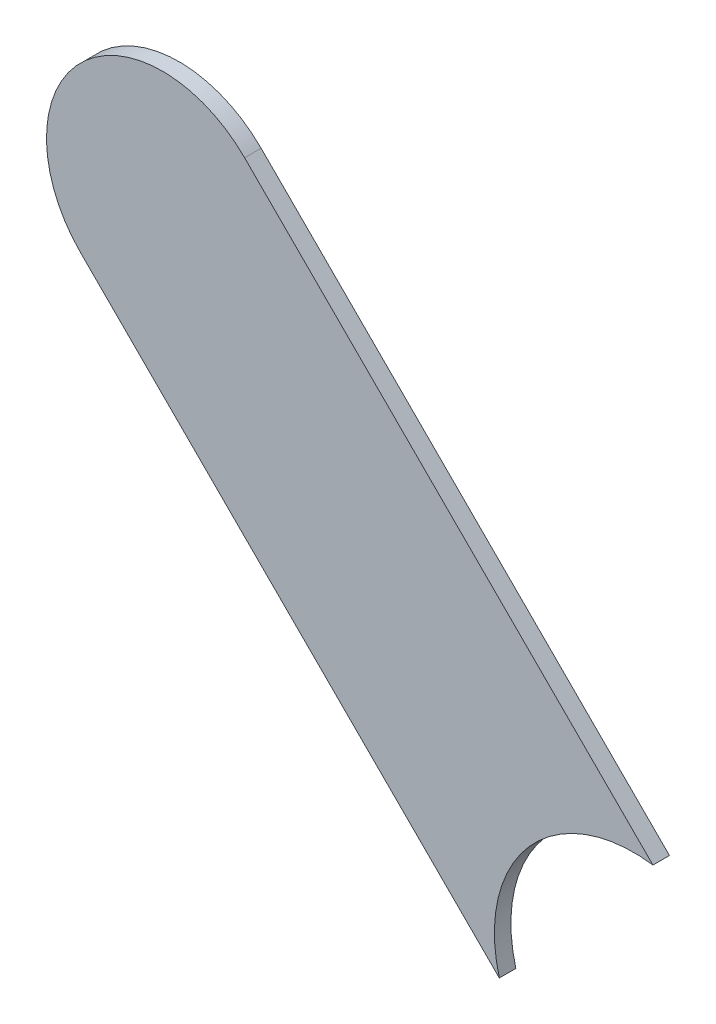
ISO-10303-21;
HEADER;
FILE_DESCRIPTION(('STEP AP214'),'2;1');
FILE_NAME('part.step','',(''),(''),'','','');
FILE_SCHEMA(('AUTOMOTIVE_DESIGN { 1 0 10303 214 1 1 1 1 }'));
ENDSEC;
DATA;
#1=APPLICATION_CONTEXT('core data for automotive mechanical design processes');
#2=APPLICATION_PROTOCOL_DEFINITION('international standard','automotive_design',2000,#1);
#3=PRODUCT_CONTEXT('',#1,'mechanical');
#4=PRODUCT('Part','Part','',(#3));
#5=PRODUCT_RELATED_PRODUCT_CATEGORY('part','',(#4));
#6=PRODUCT_DEFINITION_FORMATION('','',#4);
#7=PRODUCT_DEFINITION_CONTEXT('part definition',#1,'design');
#8=PRODUCT_DEFINITION('design','',#6,#7);
#9=PRODUCT_DEFINITION_SHAPE('','',#8);
#10=(LENGTH_UNIT() NAMED_UNIT(*) SI_UNIT(.MILLI.,.METRE.));
#11=(NAMED_UNIT(*) PLANE_ANGLE_UNIT() SI_UNIT($,.RADIAN.));
#12=(NAMED_UNIT(*) SI_UNIT($,.STERADIAN.) SOLID_ANGLE_UNIT());
#13=UNCERTAINTY_MEASURE_WITH_UNIT(LENGTH_MEASURE(1.E-05),#10,'distance_accuracy_value','');
#14=(GEOMETRIC_REPRESENTATION_CONTEXT(3) GLOBAL_UNCERTAINTY_ASSIGNED_CONTEXT((#13)) GLOBAL_UNIT_ASSIGNED_CONTEXT((#10,
#11,#12)) REPRESENTATION_CONTEXT('',''));
#15=CARTESIAN_POINT('',(0.,0.,0.));
#16=DIRECTION('',(0.,0.,1.));
#17=DIRECTION('',(1.,0.,0.));
#18=AXIS2_PLACEMENT_3D('',#15,#16,#17);
#19=CARTESIAN_POINT('',(96.20834708,104.3232229,0.));
#20=DIRECTION('',(0.707106781186542,0.707106781186553,0.));
#21=DIRECTION('',(0.707106781186553,-0.707106781186542,0.));
#22=AXIS2_PLACEMENT_3D('',#19,#20,#21);
#23=PLANE('',#22);
#24=DIRECTION('',(0.707106781186553,-0.707106781186542,0.));
#25=VECTOR('',#24,1.);
#26=CARTESIAN_POINT('',(96.20834708,104.3232229,0.03556));
#27=LINE('',#26,#25);
#28=CARTESIAN_POINT('',(96.20834708,104.3232229,0.03556));
#29=VERTEX_POINT('',#28);
#30=CARTESIAN_POINT('',(97.1106150682488,103.420954911751,0.03556));
#31=VERTEX_POINT('',#30);
#32=EDGE_CURVE('E11',#29,#31,#27,.T.);
#33=ORIENTED_EDGE('',*,*,#32,.F.);
#34=DIRECTION('',(0.,0.,1.));
#35=VECTOR('',#34,1.);
#36=CARTESIAN_POINT('',(96.20834708,104.3232229,0.));
#37=LINE('',#36,#35);
#38=CARTESIAN_POINT('',(96.20834708,104.3232229,0.));
#39=VERTEX_POINT('',#38);
#40=EDGE_CURVE('E24',#39,#29,#37,.T.);
#41=ORIENTED_EDGE('',*,*,#40,.F.);
#42=DIRECTION('',(0.707106781186553,-0.707106781186542,0.));
#43=VECTOR('',#42,1.);
#44=CARTESIAN_POINT('',(96.20834708,104.3232229,0.));
#45=LINE('',#44,#43);
#46=CARTESIAN_POINT('',(97.1106150682488,103.420954911751,0.));
#47=VERTEX_POINT('',#46);
#48=EDGE_CURVE('E75',#39,#47,#45,.T.);
#49=ORIENTED_EDGE('',*,*,#48,.T.);
#50=DIRECTION('',(0.,0.,1.));
#51=VECTOR('',#50,1.);
#52=CARTESIAN_POINT('',(97.1106150682488,103.420954911751,0.));
#53=LINE('',#52,#51);
#54=EDGE_CURVE('E37',#47,#31,#53,.T.);
#55=ORIENTED_EDGE('',*,*,#54,.T.);
#56=EDGE_LOOP('',(#33,#41,#49,#55));
#57=FACE_BOUND('',#56,.T.);
#58=ADVANCED_FACE('F17',(#57),#23,.F.);
#59=CARTESIAN_POINT('',(97.4000084,103.50001906,0.));
#60=DIRECTION('',(0.,0.,-1.));
#61=DIRECTION('',(1.,0.,0.));
#62=AXIS2_PLACEMENT_3D('',#59,#60,#61);
#63=CYLINDRICAL_SURFACE('',#62,0.2999994);
#64=DIRECTION('',(0.,0.,1.));
#65=VECTOR('',#64,1.);
#66=CARTESIAN_POINT('',(97.4415466764633,103.797128823537,0.));
#67=LINE('',#66,#65);
#68=CARTESIAN_POINT('',(97.4415466764633,103.797128823537,0.));
#69=VERTEX_POINT('',#68);
#70=CARTESIAN_POINT('',(97.4415466764633,103.797128823537,0.03556));
#71=VERTEX_POINT('',#70);
#72=EDGE_CURVE('E67',#69,#71,#67,.T.);
#73=ORIENTED_EDGE('',*,*,#72,.T.);
#74=CARTESIAN_POINT('',(97.4000084,103.50001906,0.03556));
#75=DIRECTION('',(0.,0.,1.));
#76=DIRECTION('',(1.,0.,0.));
#77=AXIS2_PLACEMENT_3D('',#74,#75,#76);
#78=CIRCLE('',#77,0.2999994);
#79=EDGE_CURVE('E82',#71,#31,#78,.T.);
#80=ORIENTED_EDGE('',*,*,#79,.T.);
#81=ORIENTED_EDGE('',*,*,#54,.F.);
#82=CARTESIAN_POINT('',(97.4000084,103.50001906,0.));
#83=DIRECTION('',(0.,0.,1.));
#84=DIRECTION('',(1.,0.,0.));
#85=AXIS2_PLACEMENT_3D('',#82,#83,#84);
#86=CIRCLE('',#85,0.2999994);
#87=EDGE_CURVE('E80',#69,#47,#86,.T.);
#88=ORIENTED_EDGE('',*,*,#87,.F.);
#89=EDGE_LOOP('',(#73,#80,#81,#88));
#90=FACE_BOUND('',#89,.T.);
#91=ADVANCED_FACE('F88',(#90),#63,.F.);
#92=CARTESIAN_POINT('',(97.4415466764633,103.797128823537,0.));
#93=DIRECTION('',(-0.707106781186548,-0.707106781186548,0.));
#94=DIRECTION('',(-0.707106781186548,0.707106781186548,0.));
#95=AXIS2_PLACEMENT_3D('',#92,#93,#94);
#96=PLANE('',#95);
#97=DIRECTION('',(-0.707106781186548,0.707106781186548,0.));
#98=VECTOR('',#97,1.);
#99=CARTESIAN_POINT('',(97.56188006,103.67679544,0.03556));
#100=LINE('',#99,#98);
#101=CARTESIAN_POINT('',(96.56189984,104.67677566,0.03556));
#102=VERTEX_POINT('',#101);
#103=EDGE_CURVE('E71',#71,#102,#100,.T.);
#104=ORIENTED_EDGE('',*,*,#103,.F.);
#105=ORIENTED_EDGE('',*,*,#72,.F.);
#106=DIRECTION('',(-0.707106781186548,0.707106781186548,0.));
#107=VECTOR('',#106,1.);
#108=CARTESIAN_POINT('',(97.56188006,103.67679544,0.));
#109=LINE('',#108,#107);
#110=CARTESIAN_POINT('',(96.56189984,104.67677566,0.));
#111=VERTEX_POINT('',#110);
#112=EDGE_CURVE('E63',#69,#111,#109,.T.);
#113=ORIENTED_EDGE('',*,*,#112,.T.);
#114=DIRECTION('',(0.,0.,1.));
#115=VECTOR('',#114,1.);
#116=CARTESIAN_POINT('',(96.56189984,104.67677566,0.));
#117=LINE('',#116,#115);
#118=EDGE_CURVE('E53',#111,#102,#117,.T.);
#119=ORIENTED_EDGE('',*,*,#118,.T.);
#120=EDGE_LOOP('',(#104,#105,#113,#119));
#121=FACE_BOUND('',#120,.T.);
#122=ADVANCED_FACE('F66',(#121),#96,.F.);
#123=CARTESIAN_POINT('',(96.38512346,104.49999928,0.));
#124=DIRECTION('',(0.,0.,-1.));
#125=DIRECTION('',(0.707106781186576,0.707106781186519,0.));
#126=AXIS2_PLACEMENT_3D('',#123,#124,#125);
#127=CYLINDRICAL_SURFACE('',#126,0.249999554103216);
#128=CARTESIAN_POINT('',(96.38512346,104.49999928,0.03556));
#129=DIRECTION('',(0.,0.,1.));
#130=DIRECTION('',(0.707106781186576,0.707106781186519,0.));
#131=AXIS2_PLACEMENT_3D('',#128,#129,#130);
#132=CIRCLE('',#131,0.249999554103216);
#133=EDGE_CURVE('E59',#102,#29,#132,.T.);
#134=ORIENTED_EDGE('',*,*,#133,.F.);
#135=ORIENTED_EDGE('',*,*,#118,.F.);
#136=CARTESIAN_POINT('',(96.38512346,104.49999928,0.));
#137=DIRECTION('',(0.,0.,1.));
#138=DIRECTION('',(0.707106781186576,0.707106781186519,0.));
#139=AXIS2_PLACEMENT_3D('',#136,#137,#138);
#140=CIRCLE('',#139,0.249999554103216);
#141=EDGE_CURVE('E57',#111,#39,#140,.T.);
#142=ORIENTED_EDGE('',*,*,#141,.T.);
#143=ORIENTED_EDGE('',*,*,#40,.T.);
#144=EDGE_LOOP('',(#134,#135,#142,#143));
#145=FACE_BOUND('',#144,.T.);
#146=ADVANCED_FACE('F55',(#145),#127,.T.);
#147=CARTESIAN_POINT('',(96.20834708,104.3232229,0.));
#148=DIRECTION('',(0.,0.,-1.));
#149=DIRECTION('',(-1.,0.,0.));
#150=AXIS2_PLACEMENT_3D('',#147,#148,#149);
#151=PLANE('',#150);
#152=ORIENTED_EDGE('',*,*,#48,.F.);
#153=ORIENTED_EDGE('',*,*,#141,.F.);
#154=ORIENTED_EDGE('',*,*,#112,.F.);
#155=ORIENTED_EDGE('',*,*,#87,.T.);
#156=EDGE_LOOP('',(#152,#153,#154,#155));
#157=FACE_BOUND('',#156,.T.);
#158=ADVANCED_FACE('F74',(#157),#151,.T.);
#159=CARTESIAN_POINT('',(96.20834708,104.3232229,0.03556));
#160=DIRECTION('',(0.,0.,-1.));
#161=DIRECTION('',(-1.,0.,0.));
#162=AXIS2_PLACEMENT_3D('',#159,#160,#161);
#163=PLANE('',#162);
#164=ORIENTED_EDGE('',*,*,#133,.T.);
#165=ORIENTED_EDGE('',*,*,#32,.T.);
#166=ORIENTED_EDGE('',*,*,#79,.F.);
#167=ORIENTED_EDGE('',*,*,#103,.T.);
#168=EDGE_LOOP('',(#164,#165,#166,#167));
#169=FACE_BOUND('',#168,.T.);
#170=ADVANCED_FACE('F91',(#169),#163,.F.);
#171=CLOSED_SHELL('',(#58,#91,#122,#146,#158,#170));
#172=MANIFOLD_SOLID_BREP('B1',#171);
#173=ADVANCED_BREP_SHAPE_REPRESENTATION('',(#18,#172),#14);
#174=SHAPE_DEFINITION_REPRESENTATION(#9,#173);
ENDSEC;
END-ISO-10303-21;
